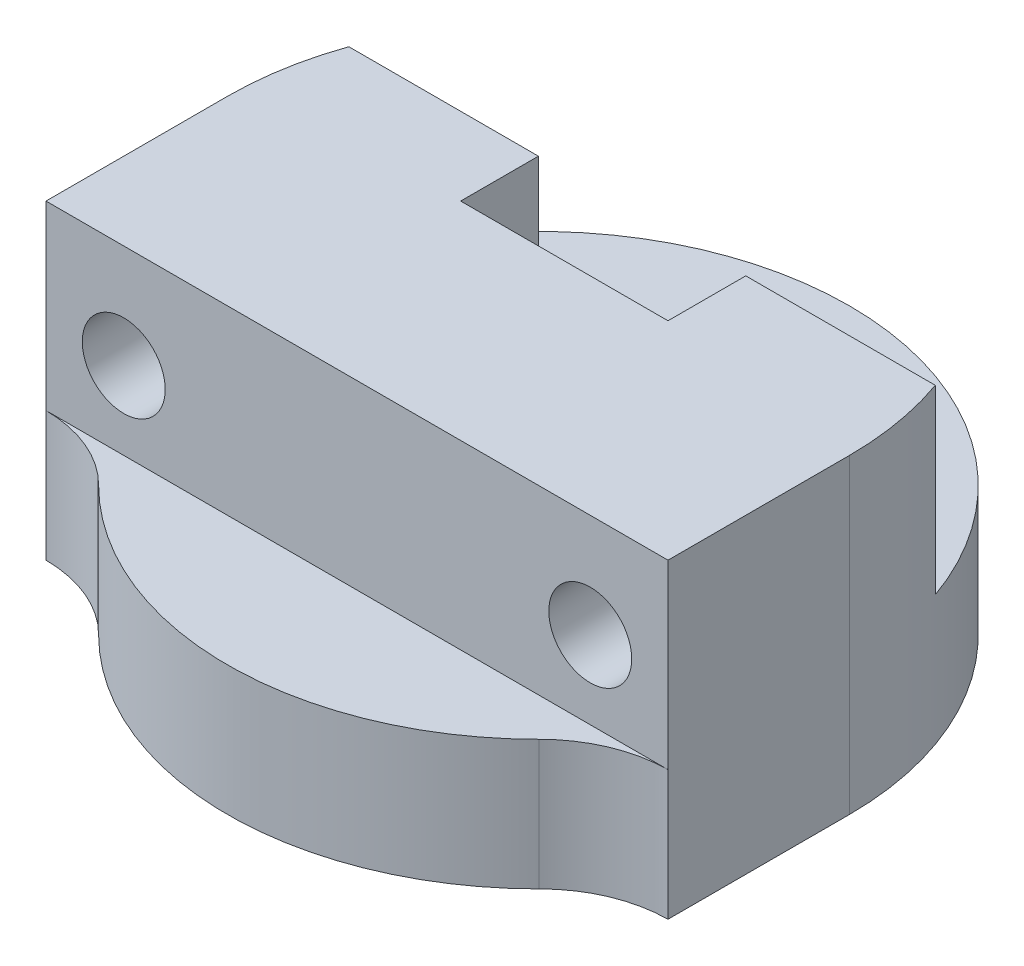
ISO-10303-21;
HEADER;
FILE_DESCRIPTION(('STEP AP214'),'2;1');
FILE_NAME('part.step','',(''),(''),'','','');
FILE_SCHEMA(('AUTOMOTIVE_DESIGN { 1 0 10303 214 1 1 1 1 }'));
ENDSEC;
DATA;
#1=APPLICATION_CONTEXT('core data for automotive mechanical design processes');
#2=APPLICATION_PROTOCOL_DEFINITION('international standard','automotive_design',2000,#1);
#3=PRODUCT_CONTEXT('',#1,'mechanical');
#4=PRODUCT('Part','Part','',(#3));
#5=PRODUCT_RELATED_PRODUCT_CATEGORY('part','',(#4));
#6=PRODUCT_DEFINITION_FORMATION('','',#4);
#7=PRODUCT_DEFINITION_CONTEXT('part definition',#1,'design');
#8=PRODUCT_DEFINITION('design','',#6,#7);
#9=PRODUCT_DEFINITION_SHAPE('','',#8);
#10=(LENGTH_UNIT() NAMED_UNIT(*) SI_UNIT(.MILLI.,.METRE.));
#11=(NAMED_UNIT(*) PLANE_ANGLE_UNIT() SI_UNIT($,.RADIAN.));
#12=(NAMED_UNIT(*) SI_UNIT($,.STERADIAN.) SOLID_ANGLE_UNIT());
#13=UNCERTAINTY_MEASURE_WITH_UNIT(LENGTH_MEASURE(1.E-05),#10,'distance_accuracy_value','');
#14=(GEOMETRIC_REPRESENTATION_CONTEXT(3) GLOBAL_UNCERTAINTY_ASSIGNED_CONTEXT((#13)) GLOBAL_UNIT_ASSIGNED_CONTEXT((#10,
#11,#12)) REPRESENTATION_CONTEXT('',''));
#15=CARTESIAN_POINT('',(0.,0.,0.));
#16=DIRECTION('',(0.,0.,1.));
#17=DIRECTION('',(1.,0.,0.));
#18=AXIS2_PLACEMENT_3D('',#15,#16,#17);
#19=CARTESIAN_POINT('',(0.,12.,-4.));
#20=DIRECTION('',(0.,0.,-1.));
#21=DIRECTION('',(-1.,0.,0.));
#22=AXIS2_PLACEMENT_3D('',#19,#20,#21);
#23=PLANE('',#22);
#24=DIRECTION('',(0.,-1.,0.));
#25=VECTOR('',#24,1.);
#26=CARTESIAN_POINT('',(4.,12.,-4.));
#27=LINE('',#26,#25);
#28=CARTESIAN_POINT('',(4.,12.,-4.));
#29=VERTEX_POINT('',#28);
#30=CARTESIAN_POINT('',(4.,5.,-4.));
#31=VERTEX_POINT('',#30);
#32=EDGE_CURVE('E189',#29,#31,#27,.T.);
#33=ORIENTED_EDGE('',*,*,#32,.F.);
#34=DIRECTION('',(1.,0.,0.));
#35=VECTOR('',#34,1.);
#36=CARTESIAN_POINT('',(0.,12.,-4.));
#37=LINE('',#36,#35);
#38=CARTESIAN_POINT('',(11.3137084989848,12.,-4.));
#39=VERTEX_POINT('',#38);
#40=EDGE_CURVE('E223',#29,#39,#37,.T.);
#41=ORIENTED_EDGE('',*,*,#40,.T.);
#42=DIRECTION('',(0.,-1.,0.));
#43=VECTOR('',#42,1.);
#44=CARTESIAN_POINT('',(11.3137084989848,12.,-4.));
#45=LINE('',#44,#43);
#46=CARTESIAN_POINT('',(11.3137084989848,5.,-4.));
#47=VERTEX_POINT('',#46);
#48=EDGE_CURVE('E243',#39,#47,#45,.T.);
#49=ORIENTED_EDGE('',*,*,#48,.T.);
#50=DIRECTION('',(1.,0.,0.));
#51=VECTOR('',#50,1.);
#52=CARTESIAN_POINT('',(0.,5.,-4.));
#53=LINE('',#52,#51);
#54=EDGE_CURVE('E210',#31,#47,#53,.T.);
#55=ORIENTED_EDGE('',*,*,#54,.F.);
#56=EDGE_LOOP('',(#33,#41,#49,#55));
#57=FACE_BOUND('',#56,.T.);
#58=ADVANCED_FACE('F39',(#57),#23,.T.);
#59=CARTESIAN_POINT('',(0.,5.,0.));
#60=DIRECTION('',(0.,1.,0.));
#61=DIRECTION('',(0.,0.,1.));
#62=AXIS2_PLACEMENT_3D('',#59,#60,#61);
#63=PLANE('',#62);
#64=DIRECTION('',(0.,0.,-1.));
#65=VECTOR('',#64,1.);
#66=CARTESIAN_POINT('',(4.,5.,0.));
#67=LINE('',#66,#65);
#68=CARTESIAN_POINT('',(4.,5.,-5.));
#69=VERTEX_POINT('',#68);
#70=EDGE_CURVE('E152',#31,#69,#67,.T.);
#71=ORIENTED_EDGE('',*,*,#70,.F.);
#72=ORIENTED_EDGE('',*,*,#54,.T.);
#73=CARTESIAN_POINT('',(0.,5.,0.));
#74=DIRECTION('',(0.,1.,0.));
#75=DIRECTION('',(0.,0.,1.));
#76=AXIS2_PLACEMENT_3D('',#73,#74,#75);
#77=CIRCLE('',#76,12.);
#78=CARTESIAN_POINT('',(-11.3137084989848,5.,-4.));
#79=VERTEX_POINT('',#78);
#80=EDGE_CURVE('E250',#47,#79,#77,.T.);
#81=ORIENTED_EDGE('',*,*,#80,.T.);
#82=CARTESIAN_POINT('',(-4.,5.,-4.));
#83=VERTEX_POINT('',#82);
#84=EDGE_CURVE('E236',#79,#83,#53,.T.);
#85=ORIENTED_EDGE('',*,*,#84,.T.);
#86=DIRECTION('',(0.,0.,1.));
#87=VECTOR('',#86,1.);
#88=CARTESIAN_POINT('',(-4.,5.,0.));
#89=LINE('',#88,#87);
#90=CARTESIAN_POINT('',(-4.,5.,-5.));
#91=VERTEX_POINT('',#90);
#92=EDGE_CURVE('E187',#91,#83,#89,.T.);
#93=ORIENTED_EDGE('',*,*,#92,.F.);
#94=DIRECTION('',(-1.,0.,0.));
#95=VECTOR('',#94,1.);
#96=CARTESIAN_POINT('',(0.,5.,-5.));
#97=LINE('',#96,#95);
#98=EDGE_CURVE('E192',#69,#91,#97,.T.);
#99=ORIENTED_EDGE('',*,*,#98,.F.);
#100=EDGE_LOOP('',(#71,#72,#81,#85,#93,#99));
#101=FACE_BOUND('',#100,.T.);
#102=ADVANCED_FACE('F331',(#101),#63,.T.);
#103=CARTESIAN_POINT('',(0.,5.,0.));
#104=DIRECTION('',(0.,-1.,0.));
#105=DIRECTION('',(0.,0.,-1.));
#106=AXIS2_PLACEMENT_3D('',#103,#104,#105);
#107=CYLINDRICAL_SURFACE('',#106,12.);
#108=CARTESIAN_POINT('',(0.,0.,0.));
#109=DIRECTION('',(0.,1.,0.));
#110=DIRECTION('',(0.,0.,1.));
#111=AXIS2_PLACEMENT_3D('',#108,#109,#110);
#112=CIRCLE('',#111,12.);
#113=CARTESIAN_POINT('',(12.,0.,0.));
#114=VERTEX_POINT('',#113);
#115=CARTESIAN_POINT('',(-12.,0.,0.));
#116=VERTEX_POINT('',#115);
#117=EDGE_CURVE('E249',#114,#116,#112,.T.);
#118=ORIENTED_EDGE('',*,*,#117,.T.);
#119=DIRECTION('',(0.,-1.,0.));
#120=VECTOR('',#119,1.);
#121=CARTESIAN_POINT('',(-12.,5.,0.));
#122=LINE('',#121,#120);
#123=CARTESIAN_POINT('',(-12.,12.,0.));
#124=VERTEX_POINT('',#123);
#125=EDGE_CURVE('E242',#124,#116,#122,.T.);
#126=ORIENTED_EDGE('',*,*,#125,.F.);
#127=CARTESIAN_POINT('',(0.,12.,0.));
#128=DIRECTION('',(0.,1.,0.));
#129=DIRECTION('',(0.,0.,1.));
#130=AXIS2_PLACEMENT_3D('',#127,#128,#129);
#131=CIRCLE('',#130,12.);
#132=CARTESIAN_POINT('',(-11.3137084989848,12.,-4.));
#133=VERTEX_POINT('',#132);
#134=EDGE_CURVE('E222',#133,#124,#131,.T.);
#135=ORIENTED_EDGE('',*,*,#134,.F.);
#136=DIRECTION('',(0.,-1.,0.));
#137=VECTOR('',#136,1.);
#138=CARTESIAN_POINT('',(-11.3137084989848,12.,-4.));
#139=LINE('',#138,#137);
#140=EDGE_CURVE('E246',#133,#79,#139,.T.);
#141=ORIENTED_EDGE('',*,*,#140,.T.);
#142=ORIENTED_EDGE('',*,*,#80,.F.);
#143=ORIENTED_EDGE('',*,*,#48,.F.);
#144=CARTESIAN_POINT('',(12.,12.,0.));
#145=VERTEX_POINT('',#144);
#146=EDGE_CURVE('E227',#145,#39,#131,.T.);
#147=ORIENTED_EDGE('',*,*,#146,.F.);
#148=DIRECTION('',(0.,-1.,0.));
#149=VECTOR('',#148,1.);
#150=CARTESIAN_POINT('',(12.,5.,0.));
#151=LINE('',#150,#149);
#152=EDGE_CURVE('E255',#145,#114,#151,.T.);
#153=ORIENTED_EDGE('',*,*,#152,.T.);
#154=EDGE_LOOP('',(#118,#126,#135,#141,#142,#143,#147,#153));
#155=FACE_BOUND('',#154,.T.);
#156=ADVANCED_FACE('F307',(#155),#107,.T.);
#157=CARTESIAN_POINT('',(-12.,5.,0.));
#158=DIRECTION('',(-1.,0.,0.));
#159=DIRECTION('',(0.,0.,1.));
#160=AXIS2_PLACEMENT_3D('',#157,#158,#159);
#161=PLANE('',#160);
#162=DIRECTION('',(0.,0.,-1.));
#163=VECTOR('',#162,1.);
#164=CARTESIAN_POINT('',(-12.,0.,0.));
#165=LINE('',#164,#163);
#166=CARTESIAN_POINT('',(-12.,0.,7.));
#167=VERTEX_POINT('',#166);
#168=EDGE_CURVE('E258',#167,#116,#165,.T.);
#169=ORIENTED_EDGE('',*,*,#168,.F.);
#170=DIRECTION('',(0.,-1.,0.));
#171=VECTOR('',#170,1.);
#172=CARTESIAN_POINT('',(-12.,5.,7.));
#173=LINE('',#172,#171);
#174=CARTESIAN_POINT('',(-12.,5.,7.));
#175=VERTEX_POINT('',#174);
#176=EDGE_CURVE('E270',#175,#167,#173,.T.);
#177=ORIENTED_EDGE('',*,*,#176,.F.);
#178=CARTESIAN_POINT('',(-12.,12.,7.));
#179=VERTEX_POINT('',#178);
#180=EDGE_CURVE('E271',#179,#175,#173,.T.);
#181=ORIENTED_EDGE('',*,*,#180,.F.);
#182=DIRECTION('',(0.,0.,1.));
#183=VECTOR('',#182,1.);
#184=CARTESIAN_POINT('',(-12.,12.,0.));
#185=LINE('',#184,#183);
#186=EDGE_CURVE('E226',#124,#179,#185,.T.);
#187=ORIENTED_EDGE('',*,*,#186,.F.);
#188=ORIENTED_EDGE('',*,*,#125,.T.);
#189=EDGE_LOOP('',(#169,#177,#181,#187,#188));
#190=FACE_BOUND('',#189,.T.);
#191=ADVANCED_FACE('F293',(#190),#161,.T.);
#192=CARTESIAN_POINT('',(0.,5.,0.));
#193=DIRECTION('',(0.,-1.,0.));
#194=DIRECTION('',(0.,0.,-1.));
#195=AXIS2_PLACEMENT_3D('',#192,#193,#194);
#196=CYLINDRICAL_SURFACE('',#195,12.);
#197=CARTESIAN_POINT('',(0.,0.,0.));
#198=DIRECTION('',(0.,1.,0.));
#199=DIRECTION('',(0.,0.,1.));
#200=AXIS2_PLACEMENT_3D('',#197,#198,#199);
#201=CIRCLE('',#200,12.);
#202=CARTESIAN_POINT('',(-8.50007183781951,0.,8.4704650847464));
#203=VERTEX_POINT('',#202);
#204=CARTESIAN_POINT('',(8.50007183781951,0.,8.4704650847464));
#205=VERTEX_POINT('',#204);
#206=EDGE_CURVE('E261',#203,#205,#201,.T.);
#207=ORIENTED_EDGE('',*,*,#206,.T.);
#208=DIRECTION('',(0.,-1.,0.));
#209=VECTOR('',#208,1.);
#210=CARTESIAN_POINT('',(8.50007183781951,5.,8.4704650847464));
#211=LINE('',#210,#209);
#212=CARTESIAN_POINT('',(8.50007183781951,5.,8.4704650847464));
#213=VERTEX_POINT('',#212);
#214=EDGE_CURVE('E54',#205,#213,#211,.F.);
#215=ORIENTED_EDGE('',*,*,#214,.T.);
#216=CARTESIAN_POINT('',(0.,5.,0.));
#217=DIRECTION('',(0.,1.,0.));
#218=DIRECTION('',(0.,0.,1.));
#219=AXIS2_PLACEMENT_3D('',#216,#217,#218);
#220=CIRCLE('',#219,12.);
#221=CARTESIAN_POINT('',(-8.50007183781951,5.,8.4704650847464));
#222=VERTEX_POINT('',#221);
#223=EDGE_CURVE('E252',#222,#213,#220,.T.);
#224=ORIENTED_EDGE('',*,*,#223,.F.);
#225=DIRECTION('',(0.,-1.,0.));
#226=VECTOR('',#225,1.);
#227=CARTESIAN_POINT('',(-8.50007183781951,5.,8.4704650847464));
#228=LINE('',#227,#226);
#229=EDGE_CURVE('E276',#222,#203,#228,.T.);
#230=ORIENTED_EDGE('',*,*,#229,.T.);
#231=EDGE_LOOP('',(#207,#215,#224,#230));
#232=FACE_BOUND('',#231,.T.);
#233=ADVANCED_FACE('F295',(#232),#196,.T.);
#234=CARTESIAN_POINT('',(0.,5.,7.));
#235=DIRECTION('',(0.,0.,-1.));
#236=DIRECTION('',(-1.,0.,0.));
#237=AXIS2_PLACEMENT_3D('',#234,#235,#236);
#238=PLANE('',#237);
#239=CARTESIAN_POINT('',(9.,8.,7.));
#240=DIRECTION('',(0.,0.,1.));
#241=DIRECTION('',(1.,0.,0.));
#242=AXIS2_PLACEMENT_3D('',#239,#240,#241);
#243=CIRCLE('',#242,1.6);
#244=CARTESIAN_POINT('',(10.6,8.,7.));
#245=VERTEX_POINT('',#244);
#246=EDGE_CURVE('E199',#245,#245,#243,.T.);
#247=ORIENTED_EDGE('',*,*,#246,.F.);
#248=EDGE_LOOP('',(#247));
#249=FACE_BOUND('',#248,.T.);
#250=CARTESIAN_POINT('',(-9.,8.,7.));
#251=DIRECTION('',(0.,0.,1.));
#252=DIRECTION('',(-1.,0.,0.));
#253=AXIS2_PLACEMENT_3D('',#250,#251,#252);
#254=CIRCLE('',#253,1.6);
#255=CARTESIAN_POINT('',(-10.6,8.,7.));
#256=VERTEX_POINT('',#255);
#257=EDGE_CURVE('E194',#256,#256,#254,.T.);
#258=ORIENTED_EDGE('',*,*,#257,.F.);
#259=EDGE_LOOP('',(#258));
#260=FACE_BOUND('',#259,.T.);
#261=DIRECTION('',(1.,0.,0.));
#262=VECTOR('',#261,1.);
#263=CARTESIAN_POINT('',(0.,5.,7.));
#264=LINE('',#263,#262);
#265=CARTESIAN_POINT('',(12.,5.,7.));
#266=VERTEX_POINT('',#265);
#267=EDGE_CURVE('E239',#175,#266,#264,.T.);
#268=ORIENTED_EDGE('',*,*,#267,.T.);
#269=DIRECTION('',(0.,-1.,0.));
#270=VECTOR('',#269,1.);
#271=CARTESIAN_POINT('',(12.,5.,7.));
#272=LINE('',#271,#270);
#273=CARTESIAN_POINT('',(12.,12.,7.));
#274=VERTEX_POINT('',#273);
#275=EDGE_CURVE('E267',#274,#266,#272,.T.);
#276=ORIENTED_EDGE('',*,*,#275,.F.);
#277=DIRECTION('',(1.,0.,0.));
#278=VECTOR('',#277,1.);
#279=CARTESIAN_POINT('',(0.,12.,7.));
#280=LINE('',#279,#278);
#281=EDGE_CURVE('E230',#179,#274,#280,.T.);
#282=ORIENTED_EDGE('',*,*,#281,.F.);
#283=ORIENTED_EDGE('',*,*,#180,.T.);
#284=EDGE_LOOP('',(#268,#276,#282,#283));
#285=FACE_BOUND('',#284,.T.);
#286=ADVANCED_FACE('F318',(#249,#260,#285),#238,.F.);
#287=CARTESIAN_POINT('',(12.,5.,0.));
#288=DIRECTION('',(-1.,0.,0.));
#289=DIRECTION('',(0.,0.,1.));
#290=AXIS2_PLACEMENT_3D('',#287,#288,#289);
#291=PLANE('',#290);
#292=DIRECTION('',(0.,0.,-1.));
#293=VECTOR('',#292,1.);
#294=CARTESIAN_POINT('',(12.,0.,0.));
#295=LINE('',#294,#293);
#296=CARTESIAN_POINT('',(12.,0.,7.));
#297=VERTEX_POINT('',#296);
#298=EDGE_CURVE('E253',#297,#114,#295,.T.);
#299=ORIENTED_EDGE('',*,*,#298,.T.);
#300=ORIENTED_EDGE('',*,*,#152,.F.);
#301=DIRECTION('',(0.,0.,-1.));
#302=VECTOR('',#301,1.);
#303=CARTESIAN_POINT('',(12.,12.,0.));
#304=LINE('',#303,#302);
#305=EDGE_CURVE('E233',#274,#145,#304,.T.);
#306=ORIENTED_EDGE('',*,*,#305,.F.);
#307=ORIENTED_EDGE('',*,*,#275,.T.);
#308=EDGE_CURVE('E266',#266,#297,#272,.T.);
#309=ORIENTED_EDGE('',*,*,#308,.T.);
#310=EDGE_LOOP('',(#299,#300,#306,#307,#309));
#311=FACE_BOUND('',#310,.T.);
#312=ADVANCED_FACE('F304',(#311),#291,.F.);
#313=ORIENTED_EDGE('',*,*,#267,.F.);
#314=CARTESIAN_POINT('',(-12.041768436911,5.,11.9998255367241));
#315=DIRECTION('',(0.,1.,0.));
#316=DIRECTION('',(0.,0.,1.));
#317=AXIS2_PLACEMENT_3D('',#314,#315,#316);
#318=CIRCLE('',#317,5.);
#319=EDGE_CURVE('E11',#175,#222,#318,.F.);
#320=ORIENTED_EDGE('',*,*,#319,.T.);
#321=ORIENTED_EDGE('',*,*,#223,.T.);
#322=CARTESIAN_POINT('',(12.041768436911,5.,11.9998255367241));
#323=DIRECTION('',(0.,1.,0.));
#324=DIRECTION('',(0.,0.,1.));
#325=AXIS2_PLACEMENT_3D('',#322,#323,#324);
#326=CIRCLE('',#325,5.);
#327=EDGE_CURVE('E282',#213,#266,#326,.F.);
#328=ORIENTED_EDGE('',*,*,#327,.T.);
#329=EDGE_LOOP('',(#313,#320,#321,#328));
#330=FACE_BOUND('',#329,.T.);
#331=ADVANCED_FACE('F297',(#330),#63,.T.);
#332=CARTESIAN_POINT('',(0.,0.,0.));
#333=DIRECTION('',(0.,1.,0.));
#334=DIRECTION('',(0.,0.,1.));
#335=AXIS2_PLACEMENT_3D('',#332,#333,#334);
#336=PLANE('',#335);
#337=DIRECTION('',(1.,0.,0.));
#338=VECTOR('',#337,1.);
#339=CARTESIAN_POINT('',(-4.,0.,-1.));
#340=LINE('',#339,#338);
#341=CARTESIAN_POINT('',(-4.,0.,-1.));
#342=VERTEX_POINT('',#341);
#343=CARTESIAN_POINT('',(4.,0.,-1.));
#344=VERTEX_POINT('',#343);
#345=EDGE_CURVE('E156',#342,#344,#340,.T.);
#346=ORIENTED_EDGE('',*,*,#345,.T.);
#347=DIRECTION('',(0.,0.,-1.));
#348=VECTOR('',#347,1.);
#349=CARTESIAN_POINT('',(4.,0.,-5.));
#350=LINE('',#349,#348);
#351=CARTESIAN_POINT('',(4.,0.,-5.));
#352=VERTEX_POINT('',#351);
#353=EDGE_CURVE('E149',#344,#352,#350,.T.);
#354=ORIENTED_EDGE('',*,*,#353,.T.);
#355=DIRECTION('',(-1.,0.,0.));
#356=VECTOR('',#355,1.);
#357=CARTESIAN_POINT('',(-4.,0.,-5.));
#358=LINE('',#357,#356);
#359=CARTESIAN_POINT('',(-4.,0.,-5.));
#360=VERTEX_POINT('',#359);
#361=EDGE_CURVE('E160',#352,#360,#358,.T.);
#362=ORIENTED_EDGE('',*,*,#361,.T.);
#363=DIRECTION('',(0.,0.,1.));
#364=VECTOR('',#363,1.);
#365=CARTESIAN_POINT('',(-4.,0.,-5.));
#366=LINE('',#365,#364);
#367=EDGE_CURVE('E165',#360,#342,#366,.T.);
#368=ORIENTED_EDGE('',*,*,#367,.T.);
#369=EDGE_LOOP('',(#346,#354,#362,#368));
#370=FACE_BOUND('',#369,.T.);
#371=CARTESIAN_POINT('',(9.,0.,0.));
#372=DIRECTION('',(0.,-1.,0.));
#373=DIRECTION('',(0.,0.,-1.));
#374=AXIS2_PLACEMENT_3D('',#371,#372,#373);
#375=CIRCLE('',#374,1.5);
#376=CARTESIAN_POINT('',(9.,0.,-1.5));
#377=VERTEX_POINT('',#376);
#378=EDGE_CURVE('E211',#377,#377,#375,.T.);
#379=ORIENTED_EDGE('',*,*,#378,.F.);
#380=EDGE_LOOP('',(#379));
#381=FACE_BOUND('',#380,.T.);
#382=CARTESIAN_POINT('',(-9.,0.,0.));
#383=DIRECTION('',(0.,-1.,0.));
#384=DIRECTION('',(0.,0.,1.));
#385=AXIS2_PLACEMENT_3D('',#382,#383,#384);
#386=CIRCLE('',#385,1.5);
#387=CARTESIAN_POINT('',(-9.,0.,1.5));
#388=VERTEX_POINT('',#387);
#389=EDGE_CURVE('E198',#388,#388,#386,.T.);
#390=ORIENTED_EDGE('',*,*,#389,.F.);
#391=EDGE_LOOP('',(#390));
#392=FACE_BOUND('',#391,.T.);
#393=ORIENTED_EDGE('',*,*,#117,.F.);
#394=ORIENTED_EDGE('',*,*,#298,.F.);
#395=CARTESIAN_POINT('',(12.041768436911,0.,11.9998255367241));
#396=DIRECTION('',(0.,1.,0.));
#397=DIRECTION('',(0.,0.,1.));
#398=AXIS2_PLACEMENT_3D('',#395,#396,#397);
#399=CIRCLE('',#398,5.);
#400=EDGE_CURVE('E280',#297,#205,#399,.T.);
#401=ORIENTED_EDGE('',*,*,#400,.T.);
#402=ORIENTED_EDGE('',*,*,#206,.F.);
#403=CARTESIAN_POINT('',(-12.041768436911,0.,11.9998255367241));
#404=DIRECTION('',(0.,1.,0.));
#405=DIRECTION('',(0.,0.,1.));
#406=AXIS2_PLACEMENT_3D('',#403,#404,#405);
#407=CIRCLE('',#406,5.);
#408=EDGE_CURVE('E47',#203,#167,#407,.T.);
#409=ORIENTED_EDGE('',*,*,#408,.T.);
#410=ORIENTED_EDGE('',*,*,#168,.T.);
#411=EDGE_LOOP('',(#393,#394,#401,#402,#409,#410));
#412=FACE_BOUND('',#411,.T.);
#413=ADVANCED_FACE('F167',(#370,#381,#392,#412),#336,.F.);
#414=DIRECTION('',(0.,1.,0.));
#415=VECTOR('',#414,1.);
#416=CARTESIAN_POINT('',(-4.,12.,-4.));
#417=LINE('',#416,#415);
#418=CARTESIAN_POINT('',(-4.,12.,-4.));
#419=VERTEX_POINT('',#418);
#420=EDGE_CURVE('E181',#83,#419,#417,.T.);
#421=ORIENTED_EDGE('',*,*,#420,.F.);
#422=ORIENTED_EDGE('',*,*,#84,.F.);
#423=ORIENTED_EDGE('',*,*,#140,.F.);
#424=EDGE_CURVE('E219',#133,#419,#37,.T.);
#425=ORIENTED_EDGE('',*,*,#424,.T.);
#426=EDGE_LOOP('',(#421,#422,#423,#425));
#427=FACE_BOUND('',#426,.T.);
#428=ADVANCED_FACE('F334',(#427),#23,.T.);
#429=CARTESIAN_POINT('',(0.,12.,0.));
#430=DIRECTION('',(0.,1.,0.));
#431=DIRECTION('',(0.,0.,1.));
#432=AXIS2_PLACEMENT_3D('',#429,#430,#431);
#433=PLANE('',#432);
#434=DIRECTION('',(0.,0.,-1.));
#435=VECTOR('',#434,1.);
#436=CARTESIAN_POINT('',(4.,12.,-5.));
#437=LINE('',#436,#435);
#438=CARTESIAN_POINT('',(4.,12.,-1.));
#439=VERTEX_POINT('',#438);
#440=EDGE_CURVE('E173',#439,#29,#437,.T.);
#441=ORIENTED_EDGE('',*,*,#440,.F.);
#442=DIRECTION('',(1.,0.,0.));
#443=VECTOR('',#442,1.);
#444=CARTESIAN_POINT('',(-4.,12.,-1.));
#445=LINE('',#444,#443);
#446=CARTESIAN_POINT('',(-4.,12.,-1.));
#447=VERTEX_POINT('',#446);
#448=EDGE_CURVE('E170',#447,#439,#445,.T.);
#449=ORIENTED_EDGE('',*,*,#448,.F.);
#450=DIRECTION('',(0.,0.,1.));
#451=VECTOR('',#450,1.);
#452=CARTESIAN_POINT('',(-4.,12.,0.));
#453=LINE('',#452,#451);
#454=EDGE_CURVE('E241',#419,#447,#453,.T.);
#455=ORIENTED_EDGE('',*,*,#454,.F.);
#456=ORIENTED_EDGE('',*,*,#424,.F.);
#457=ORIENTED_EDGE('',*,*,#134,.T.);
#458=ORIENTED_EDGE('',*,*,#186,.T.);
#459=ORIENTED_EDGE('',*,*,#281,.T.);
#460=ORIENTED_EDGE('',*,*,#305,.T.);
#461=ORIENTED_EDGE('',*,*,#146,.T.);
#462=ORIENTED_EDGE('',*,*,#40,.F.);
#463=EDGE_LOOP('',(#441,#449,#455,#456,#457,#458,#459,#460,#461,#462));
#464=FACE_BOUND('',#463,.T.);
#465=ADVANCED_FACE('F314',(#464),#433,.T.);
#466=CARTESIAN_POINT('',(-9.,10.,0.));
#467=DIRECTION('',(0.,-1.,0.));
#468=DIRECTION('',(0.,0.,-1.));
#469=AXIS2_PLACEMENT_3D('',#466,#467,#468);
#470=CYLINDRICAL_SURFACE('',#469,1.5);
#471=CARTESIAN_POINT('',(-9.,10.,0.));
#472=DIRECTION('',(0.,-1.,0.));
#473=DIRECTION('',(0.,0.,1.));
#474=AXIS2_PLACEMENT_3D('',#471,#472,#473);
#475=CIRCLE('',#474,1.5);
#476=CARTESIAN_POINT('',(-9.,10.,1.5));
#477=VERTEX_POINT('',#476);
#478=EDGE_CURVE('E214',#477,#477,#475,.T.);
#479=ORIENTED_EDGE('',*,*,#478,.F.);
#480=EDGE_LOOP('',(#479));
#481=FACE_BOUND('',#480,.T.);
#482=ORIENTED_EDGE('',*,*,#389,.T.);
#483=EDGE_LOOP('',(#482));
#484=FACE_BOUND('',#483,.T.);
#485=ADVANCED_FACE('F348',(#481,#484),#470,.F.);
#486=CARTESIAN_POINT('',(-9.,10.,0.));
#487=DIRECTION('',(0.,1.,0.));
#488=DIRECTION('',(0.,0.,1.));
#489=AXIS2_PLACEMENT_3D('',#486,#487,#488);
#490=PLANE('',#489);
#491=ORIENTED_EDGE('',*,*,#478,.T.);
#492=EDGE_LOOP('',(#491));
#493=FACE_BOUND('',#492,.T.);
#494=ADVANCED_FACE('F396',(#493),#490,.F.);
#495=CARTESIAN_POINT('',(9.,10.,0.));
#496=DIRECTION('',(0.,-1.,0.));
#497=DIRECTION('',(0.,0.,-1.));
#498=AXIS2_PLACEMENT_3D('',#495,#496,#497);
#499=CYLINDRICAL_SURFACE('',#498,1.5);
#500=CARTESIAN_POINT('',(9.,10.,0.));
#501=DIRECTION('',(0.,-1.,0.));
#502=DIRECTION('',(0.,0.,-1.));
#503=AXIS2_PLACEMENT_3D('',#500,#501,#502);
#504=CIRCLE('',#503,1.5);
#505=CARTESIAN_POINT('',(9.,10.,-1.5));
#506=VERTEX_POINT('',#505);
#507=EDGE_CURVE('E207',#506,#506,#504,.T.);
#508=ORIENTED_EDGE('',*,*,#507,.F.);
#509=EDGE_LOOP('',(#508));
#510=FACE_BOUND('',#509,.T.);
#511=ORIENTED_EDGE('',*,*,#378,.T.);
#512=EDGE_LOOP('',(#511));
#513=FACE_BOUND('',#512,.T.);
#514=ADVANCED_FACE('F392',(#510,#513),#499,.F.);
#515=CARTESIAN_POINT('',(9.,10.,0.));
#516=DIRECTION('',(0.,-1.,0.));
#517=DIRECTION('',(0.,0.,-1.));
#518=AXIS2_PLACEMENT_3D('',#515,#516,#517);
#519=PLANE('',#518);
#520=ORIENTED_EDGE('',*,*,#507,.T.);
#521=EDGE_LOOP('',(#520));
#522=FACE_BOUND('',#521,.T.);
#523=ADVANCED_FACE('F388',(#522),#519,.T.);
#524=CARTESIAN_POINT('',(-9.,8.,3.5));
#525=DIRECTION('',(0.,0.,1.));
#526=DIRECTION('',(1.,0.,0.));
#527=AXIS2_PLACEMENT_3D('',#524,#525,#526);
#528=CYLINDRICAL_SURFACE('',#527,1.6);
#529=CARTESIAN_POINT('',(-9.,8.,3.5));
#530=DIRECTION('',(0.,0.,1.));
#531=DIRECTION('',(-1.,0.,0.));
#532=AXIS2_PLACEMENT_3D('',#529,#530,#531);
#533=CIRCLE('',#532,1.6);
#534=CARTESIAN_POINT('',(-10.6,8.,3.5));
#535=VERTEX_POINT('',#534);
#536=EDGE_CURVE('E202',#535,#535,#533,.T.);
#537=ORIENTED_EDGE('',*,*,#536,.F.);
#538=EDGE_LOOP('',(#537));
#539=FACE_BOUND('',#538,.T.);
#540=ORIENTED_EDGE('',*,*,#257,.T.);
#541=EDGE_LOOP('',(#540));
#542=FACE_BOUND('',#541,.T.);
#543=ADVANCED_FACE('F384',(#539,#542),#528,.F.);
#544=CARTESIAN_POINT('',(-9.,8.,3.5));
#545=DIRECTION('',(0.,0.,-1.));
#546=DIRECTION('',(-1.,0.,0.));
#547=AXIS2_PLACEMENT_3D('',#544,#545,#546);
#548=PLANE('',#547);
#549=ORIENTED_EDGE('',*,*,#536,.T.);
#550=EDGE_LOOP('',(#549));
#551=FACE_BOUND('',#550,.T.);
#552=ADVANCED_FACE('F380',(#551),#548,.F.);
#553=CARTESIAN_POINT('',(9.,8.,3.5));
#554=DIRECTION('',(0.,0.,1.));
#555=DIRECTION('',(1.,0.,0.));
#556=AXIS2_PLACEMENT_3D('',#553,#554,#555);
#557=CYLINDRICAL_SURFACE('',#556,1.6);
#558=CARTESIAN_POINT('',(9.,8.,3.5));
#559=DIRECTION('',(0.,0.,1.));
#560=DIRECTION('',(1.,0.,0.));
#561=AXIS2_PLACEMENT_3D('',#558,#559,#560);
#562=CIRCLE('',#561,1.6);
#563=CARTESIAN_POINT('',(10.6,8.,3.5));
#564=VERTEX_POINT('',#563);
#565=EDGE_CURVE('E195',#564,#564,#562,.T.);
#566=ORIENTED_EDGE('',*,*,#565,.F.);
#567=EDGE_LOOP('',(#566));
#568=FACE_BOUND('',#567,.T.);
#569=ORIENTED_EDGE('',*,*,#246,.T.);
#570=EDGE_LOOP('',(#569));
#571=FACE_BOUND('',#570,.T.);
#572=ADVANCED_FACE('F376',(#568,#571),#557,.F.);
#573=CARTESIAN_POINT('',(9.,8.,3.5));
#574=DIRECTION('',(0.,0.,1.));
#575=DIRECTION('',(1.,0.,0.));
#576=AXIS2_PLACEMENT_3D('',#573,#574,#575);
#577=PLANE('',#576);
#578=ORIENTED_EDGE('',*,*,#565,.T.);
#579=EDGE_LOOP('',(#578));
#580=FACE_BOUND('',#579,.T.);
#581=ADVANCED_FACE('F369',(#580),#577,.T.);
#582=CARTESIAN_POINT('',(4.,0.,-5.));
#583=DIRECTION('',(1.,0.,0.));
#584=DIRECTION('',(0.,0.,-1.));
#585=AXIS2_PLACEMENT_3D('',#582,#583,#584);
#586=PLANE('',#585);
#587=ORIENTED_EDGE('',*,*,#70,.T.);
#588=DIRECTION('',(0.,1.,0.));
#589=VECTOR('',#588,1.);
#590=CARTESIAN_POINT('',(4.,0.,-5.));
#591=LINE('',#590,#589);
#592=EDGE_CURVE('E145',#352,#69,#591,.T.);
#593=ORIENTED_EDGE('',*,*,#592,.F.);
#594=ORIENTED_EDGE('',*,*,#353,.F.);
#595=DIRECTION('',(0.,1.,0.));
#596=VECTOR('',#595,1.);
#597=CARTESIAN_POINT('',(4.,0.,-1.));
#598=LINE('',#597,#596);
#599=EDGE_CURVE('E179',#344,#439,#598,.T.);
#600=ORIENTED_EDGE('',*,*,#599,.T.);
#601=ORIENTED_EDGE('',*,*,#440,.T.);
#602=ORIENTED_EDGE('',*,*,#32,.T.);
#603=EDGE_LOOP('',(#587,#593,#594,#600,#601,#602));
#604=FACE_BOUND('',#603,.T.);
#605=ADVANCED_FACE('F147',(#604),#586,.F.);
#606=CARTESIAN_POINT('',(-4.,0.,-1.));
#607=DIRECTION('',(0.,0.,1.));
#608=DIRECTION('',(1.,0.,0.));
#609=AXIS2_PLACEMENT_3D('',#606,#607,#608);
#610=PLANE('',#609);
#611=ORIENTED_EDGE('',*,*,#448,.T.);
#612=ORIENTED_EDGE('',*,*,#599,.F.);
#613=ORIENTED_EDGE('',*,*,#345,.F.);
#614=DIRECTION('',(0.,1.,0.));
#615=VECTOR('',#614,1.);
#616=CARTESIAN_POINT('',(-4.,0.,-1.));
#617=LINE('',#616,#615);
#618=EDGE_CURVE('E182',#342,#447,#617,.T.);
#619=ORIENTED_EDGE('',*,*,#618,.T.);
#620=EDGE_LOOP('',(#611,#612,#613,#619));
#621=FACE_BOUND('',#620,.T.);
#622=ADVANCED_FACE('F361',(#621),#610,.F.);
#623=CARTESIAN_POINT('',(-4.,0.,-5.));
#624=DIRECTION('',(-1.,0.,0.));
#625=DIRECTION('',(0.,0.,1.));
#626=AXIS2_PLACEMENT_3D('',#623,#624,#625);
#627=PLANE('',#626);
#628=ORIENTED_EDGE('',*,*,#92,.T.);
#629=ORIENTED_EDGE('',*,*,#420,.T.);
#630=ORIENTED_EDGE('',*,*,#454,.T.);
#631=ORIENTED_EDGE('',*,*,#618,.F.);
#632=ORIENTED_EDGE('',*,*,#367,.F.);
#633=DIRECTION('',(0.,1.,0.));
#634=VECTOR('',#633,1.);
#635=CARTESIAN_POINT('',(-4.,0.,-5.));
#636=LINE('',#635,#634);
#637=EDGE_CURVE('E155',#360,#91,#636,.T.);
#638=ORIENTED_EDGE('',*,*,#637,.T.);
#639=EDGE_LOOP('',(#628,#629,#630,#631,#632,#638));
#640=FACE_BOUND('',#639,.T.);
#641=ADVANCED_FACE('F359',(#640),#627,.F.);
#642=CARTESIAN_POINT('',(-4.,0.,-5.));
#643=DIRECTION('',(0.,0.,-1.));
#644=DIRECTION('',(-1.,0.,0.));
#645=AXIS2_PLACEMENT_3D('',#642,#643,#644);
#646=PLANE('',#645);
#647=ORIENTED_EDGE('',*,*,#98,.T.);
#648=ORIENTED_EDGE('',*,*,#637,.F.);
#649=ORIENTED_EDGE('',*,*,#361,.F.);
#650=ORIENTED_EDGE('',*,*,#592,.T.);
#651=EDGE_LOOP('',(#647,#648,#649,#650));
#652=FACE_BOUND('',#651,.T.);
#653=ADVANCED_FACE('F161',(#652),#646,.F.);
#654=CARTESIAN_POINT('',(12.041768436911,5.,11.9998255367241));
#655=DIRECTION('',(0.,1.,0.));
#656=DIRECTION('',(0.,0.,1.));
#657=AXIS2_PLACEMENT_3D('',#654,#655,#656);
#658=CYLINDRICAL_SURFACE('',#657,5.);
#659=ORIENTED_EDGE('',*,*,#327,.F.);
#660=ORIENTED_EDGE('',*,*,#214,.F.);
#661=ORIENTED_EDGE('',*,*,#400,.F.);
#662=ORIENTED_EDGE('',*,*,#308,.F.);
#663=EDGE_LOOP('',(#659,#660,#661,#662));
#664=FACE_BOUND('',#663,.T.);
#665=ADVANCED_FACE('F300',(#664),#658,.F.);
#666=CARTESIAN_POINT('',(-12.041768436911,5.,11.9998255367241));
#667=DIRECTION('',(0.,1.,0.));
#668=DIRECTION('',(0.,0.,1.));
#669=AXIS2_PLACEMENT_3D('',#666,#667,#668);
#670=CYLINDRICAL_SURFACE('',#669,5.);
#671=ORIENTED_EDGE('',*,*,#319,.F.);
#672=ORIENTED_EDGE('',*,*,#176,.T.);
#673=ORIENTED_EDGE('',*,*,#408,.F.);
#674=ORIENTED_EDGE('',*,*,#229,.F.);
#675=EDGE_LOOP('',(#671,#672,#673,#674));
#676=FACE_BOUND('',#675,.T.);
#677=ADVANCED_FACE('F41',(#676),#670,.F.);
#678=CLOSED_SHELL('',(#58,#102,#156,#191,#233,#286,#312,#331,#413,#428,#465,#485,#494,#514,#523,
#543,#552,#572,#581,#605,#622,#641,#653,#665,#677));
#679=MANIFOLD_SOLID_BREP('B2',#678);
#680=ADVANCED_BREP_SHAPE_REPRESENTATION('',(#18,#679),#14);
#681=SHAPE_DEFINITION_REPRESENTATION(#9,#680);
ENDSEC;
END-ISO-10303-21;
